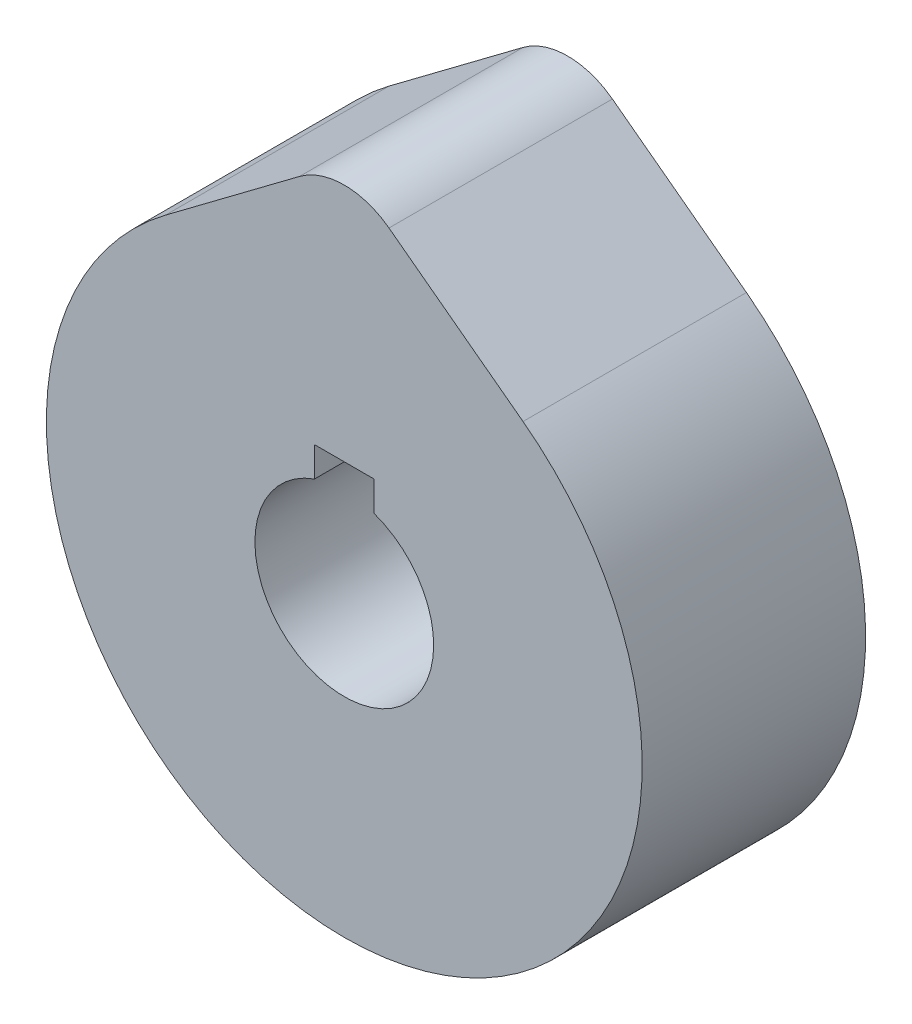
ISO-10303-21;
HEADER;
FILE_DESCRIPTION(('STEP AP214'),'2;1');
FILE_NAME('part.step','',(''),(''),'','','');
FILE_SCHEMA(('AUTOMOTIVE_DESIGN { 1 0 10303 214 1 1 1 1 }'));
ENDSEC;
DATA;
#1=APPLICATION_CONTEXT('core data for automotive mechanical design processes');
#2=APPLICATION_PROTOCOL_DEFINITION('international standard','automotive_design',2000,#1);
#3=PRODUCT_CONTEXT('',#1,'mechanical');
#4=PRODUCT('Part','Part','',(#3));
#5=PRODUCT_RELATED_PRODUCT_CATEGORY('part','',(#4));
#6=PRODUCT_DEFINITION_FORMATION('','',#4);
#7=PRODUCT_DEFINITION_CONTEXT('part definition',#1,'design');
#8=PRODUCT_DEFINITION('design','',#6,#7);
#9=PRODUCT_DEFINITION_SHAPE('','',#8);
#10=(LENGTH_UNIT() NAMED_UNIT(*) SI_UNIT(.MILLI.,.METRE.));
#11=(NAMED_UNIT(*) PLANE_ANGLE_UNIT() SI_UNIT($,.RADIAN.));
#12=(NAMED_UNIT(*) SI_UNIT($,.STERADIAN.) SOLID_ANGLE_UNIT());
#13=UNCERTAINTY_MEASURE_WITH_UNIT(LENGTH_MEASURE(1.E-05),#10,'distance_accuracy_value','');
#14=(GEOMETRIC_REPRESENTATION_CONTEXT(3) GLOBAL_UNCERTAINTY_ASSIGNED_CONTEXT((#13)) GLOBAL_UNIT_ASSIGNED_CONTEXT((#10,
#11,#12)) REPRESENTATION_CONTEXT('',''));
#15=CARTESIAN_POINT('',(0.,0.,0.));
#16=DIRECTION('',(0.,0.,1.));
#17=DIRECTION('',(1.,0.,0.));
#18=AXIS2_PLACEMENT_3D('',#15,#16,#17);
#19=CARTESIAN_POINT('',(0.,18.75,15.));
#20=DIRECTION('',(0.,0.,-1.));
#21=DIRECTION('',(-1.,0.,0.));
#22=AXIS2_PLACEMENT_3D('',#19,#20,#21);
#23=PLANE('',#22);
#24=CARTESIAN_POINT('',(0.,18.75,15.));
#25=DIRECTION('',(0.,0.,1.));
#26=DIRECTION('',(-1.,0.,0.));
#27=AXIS2_PLACEMENT_3D('',#24,#25,#26);
#28=CIRCLE('',#27,5.);
#29=CARTESIAN_POINT('',(3.00000000000002,22.75,15.));
#30=VERTEX_POINT('',#29);
#31=CARTESIAN_POINT('',(-3.00000000000002,22.75,15.));
#32=VERTEX_POINT('',#31);
#33=EDGE_CURVE('E140',#30,#32,#28,.T.);
#34=ORIENTED_EDGE('',*,*,#33,.T.);
#35=DIRECTION('',(-0.8,-0.6,0.));
#36=VECTOR('',#35,1.);
#37=CARTESIAN_POINT('',(-3.00000000000002,22.75,15.));
#38=LINE('',#37,#36);
#39=CARTESIAN_POINT('',(-12.,16.,15.));
#40=VERTEX_POINT('',#39);
#41=EDGE_CURVE('E143',#32,#40,#38,.T.);
#42=ORIENTED_EDGE('',*,*,#41,.T.);
#43=CARTESIAN_POINT('',(0.,0.,15.));
#44=DIRECTION('',(0.,0.,1.));
#45=DIRECTION('',(1.,0.,0.));
#46=AXIS2_PLACEMENT_3D('',#43,#44,#45);
#47=CIRCLE('',#46,20.);
#48=CARTESIAN_POINT('',(12.,16.,15.));
#49=VERTEX_POINT('',#48);
#50=EDGE_CURVE('E146',#40,#49,#47,.T.);
#51=ORIENTED_EDGE('',*,*,#50,.T.);
#52=DIRECTION('',(-0.8,0.6,0.));
#53=VECTOR('',#52,1.);
#54=CARTESIAN_POINT('',(3.00000000000002,22.75,15.));
#55=LINE('',#54,#53);
#56=EDGE_CURVE('E148',#49,#30,#55,.T.);
#57=ORIENTED_EDGE('',*,*,#56,.T.);
#58=EDGE_LOOP('',(#34,#42,#51,#57));
#59=FACE_BOUND('',#58,.T.);
#60=DIRECTION('',(0.,-1.,0.));
#61=VECTOR('',#60,1.);
#62=CARTESIAN_POINT('',(-2.,7.65685424949238,15.));
#63=LINE('',#62,#61);
#64=CARTESIAN_POINT('',(-2.,7.65685424949238,15.));
#65=VERTEX_POINT('',#64);
#66=CARTESIAN_POINT('',(-2.,5.65685424949238,15.));
#67=VERTEX_POINT('',#66);
#68=EDGE_CURVE('E104',#65,#67,#63,.T.);
#69=ORIENTED_EDGE('',*,*,#68,.F.);
#70=DIRECTION('',(-1.,0.,0.));
#71=VECTOR('',#70,1.);
#72=CARTESIAN_POINT('',(2.,7.65685424949238,15.));
#73=LINE('',#72,#71);
#74=CARTESIAN_POINT('',(2.,7.65685424949238,15.));
#75=VERTEX_POINT('',#74);
#76=EDGE_CURVE('E126',#75,#65,#73,.T.);
#77=ORIENTED_EDGE('',*,*,#76,.F.);
#78=DIRECTION('',(0.,1.,0.));
#79=VECTOR('',#78,1.);
#80=CARTESIAN_POINT('',(2.,7.65685424949238,15.));
#81=LINE('',#80,#79);
#82=CARTESIAN_POINT('',(2.,5.65685424949238,15.));
#83=VERTEX_POINT('',#82);
#84=EDGE_CURVE('E124',#83,#75,#81,.T.);
#85=ORIENTED_EDGE('',*,*,#84,.F.);
#86=CARTESIAN_POINT('',(0.,0.,15.));
#87=DIRECTION('',(0.,0.,1.));
#88=DIRECTION('',(1.,0.,0.));
#89=AXIS2_PLACEMENT_3D('',#86,#87,#88);
#90=CIRCLE('',#89,6.);
#91=EDGE_CURVE('E112',#67,#83,#90,.T.);
#92=ORIENTED_EDGE('',*,*,#91,.F.);
#93=EDGE_LOOP('',(#69,#77,#85,#92));
#94=FACE_BOUND('',#93,.T.);
#95=ADVANCED_FACE('F39',(#59,#94),#23,.F.);
#96=CARTESIAN_POINT('',(0.,18.75,0.));
#97=DIRECTION('',(0.,0.,-1.));
#98=DIRECTION('',(-1.,0.,0.));
#99=AXIS2_PLACEMENT_3D('',#96,#97,#98);
#100=PLANE('',#99);
#101=CARTESIAN_POINT('',(0.,18.75,0.));
#102=DIRECTION('',(0.,0.,1.));
#103=DIRECTION('',(-1.,0.,0.));
#104=AXIS2_PLACEMENT_3D('',#101,#102,#103);
#105=CIRCLE('',#104,5.);
#106=CARTESIAN_POINT('',(3.00000000000002,22.75,0.));
#107=VERTEX_POINT('',#106);
#108=CARTESIAN_POINT('',(-3.00000000000002,22.75,0.));
#109=VERTEX_POINT('',#108);
#110=EDGE_CURVE('E120',#107,#109,#105,.T.);
#111=ORIENTED_EDGE('',*,*,#110,.F.);
#112=DIRECTION('',(-0.8,0.6,0.));
#113=VECTOR('',#112,1.);
#114=CARTESIAN_POINT('',(3.00000000000002,22.75,0.));
#115=LINE('',#114,#113);
#116=CARTESIAN_POINT('',(12.,16.,0.));
#117=VERTEX_POINT('',#116);
#118=EDGE_CURVE('E144',#117,#107,#115,.T.);
#119=ORIENTED_EDGE('',*,*,#118,.F.);
#120=CARTESIAN_POINT('',(0.,0.,0.));
#121=DIRECTION('',(0.,0.,1.));
#122=DIRECTION('',(1.,0.,0.));
#123=AXIS2_PLACEMENT_3D('',#120,#121,#122);
#124=CIRCLE('',#123,20.);
#125=CARTESIAN_POINT('',(-12.,16.,0.));
#126=VERTEX_POINT('',#125);
#127=EDGE_CURVE('E155',#126,#117,#124,.T.);
#128=ORIENTED_EDGE('',*,*,#127,.F.);
#129=DIRECTION('',(-0.8,-0.6,0.));
#130=VECTOR('',#129,1.);
#131=CARTESIAN_POINT('',(-3.00000000000002,22.75,0.));
#132=LINE('',#131,#130);
#133=EDGE_CURVE('E153',#109,#126,#132,.T.);
#134=ORIENTED_EDGE('',*,*,#133,.F.);
#135=EDGE_LOOP('',(#111,#119,#128,#134));
#136=FACE_BOUND('',#135,.T.);
#137=DIRECTION('',(-1.,0.,0.));
#138=VECTOR('',#137,1.);
#139=CARTESIAN_POINT('',(2.,7.65685424949238,0.));
#140=LINE('',#139,#138);
#141=CARTESIAN_POINT('',(2.,7.65685424949238,0.));
#142=VERTEX_POINT('',#141);
#143=CARTESIAN_POINT('',(-2.,7.65685424949238,0.));
#144=VERTEX_POINT('',#143);
#145=EDGE_CURVE('E113',#142,#144,#140,.T.);
#146=ORIENTED_EDGE('',*,*,#145,.T.);
#147=DIRECTION('',(0.,-1.,0.));
#148=VECTOR('',#147,1.);
#149=CARTESIAN_POINT('',(-2.,7.65685424949238,0.));
#150=LINE('',#149,#148);
#151=CARTESIAN_POINT('',(-2.,5.65685424949238,0.));
#152=VERTEX_POINT('',#151);
#153=EDGE_CURVE('E62',#144,#152,#150,.T.);
#154=ORIENTED_EDGE('',*,*,#153,.T.);
#155=CARTESIAN_POINT('',(0.,0.,0.));
#156=DIRECTION('',(0.,0.,1.));
#157=DIRECTION('',(1.,0.,0.));
#158=AXIS2_PLACEMENT_3D('',#155,#156,#157);
#159=CIRCLE('',#158,6.);
#160=CARTESIAN_POINT('',(2.,5.65685424949238,0.));
#161=VERTEX_POINT('',#160);
#162=EDGE_CURVE('E119',#152,#161,#159,.T.);
#163=ORIENTED_EDGE('',*,*,#162,.T.);
#164=DIRECTION('',(0.,1.,0.));
#165=VECTOR('',#164,1.);
#166=CARTESIAN_POINT('',(2.,7.65685424949238,0.));
#167=LINE('',#166,#165);
#168=EDGE_CURVE('E132',#161,#142,#167,.T.);
#169=ORIENTED_EDGE('',*,*,#168,.T.);
#170=EDGE_LOOP('',(#146,#154,#163,#169));
#171=FACE_BOUND('',#170,.T.);
#172=ADVANCED_FACE('F173',(#136,#171),#100,.T.);
#173=CARTESIAN_POINT('',(0.,18.75,15.));
#174=DIRECTION('',(0.,0.,-1.));
#175=DIRECTION('',(-1.,0.,0.));
#176=AXIS2_PLACEMENT_3D('',#173,#174,#175);
#177=CYLINDRICAL_SURFACE('',#176,5.);
#178=ORIENTED_EDGE('',*,*,#110,.T.);
#179=DIRECTION('',(0.,0.,-1.));
#180=VECTOR('',#179,1.);
#181=CARTESIAN_POINT('',(-3.00000000000002,22.75,15.));
#182=LINE('',#181,#180);
#183=EDGE_CURVE('E11',#32,#109,#182,.T.);
#184=ORIENTED_EDGE('',*,*,#183,.F.);
#185=ORIENTED_EDGE('',*,*,#33,.F.);
#186=DIRECTION('',(0.,0.,-1.));
#187=VECTOR('',#186,1.);
#188=CARTESIAN_POINT('',(3.00000000000002,22.75,15.));
#189=LINE('',#188,#187);
#190=EDGE_CURVE('E150',#30,#107,#189,.T.);
#191=ORIENTED_EDGE('',*,*,#190,.T.);
#192=EDGE_LOOP('',(#178,#184,#185,#191));
#193=FACE_BOUND('',#192,.T.);
#194=ADVANCED_FACE('F41',(#193),#177,.T.);
#195=CARTESIAN_POINT('',(-3.00000000000002,22.75,15.));
#196=DIRECTION('',(0.6,-0.8,0.));
#197=DIRECTION('',(0.8,0.6,0.));
#198=AXIS2_PLACEMENT_3D('',#195,#196,#197);
#199=PLANE('',#198);
#200=ORIENTED_EDGE('',*,*,#133,.T.);
#201=DIRECTION('',(0.,0.,-1.));
#202=VECTOR('',#201,1.);
#203=CARTESIAN_POINT('',(-12.,16.,15.));
#204=LINE('',#203,#202);
#205=EDGE_CURVE('E47',#40,#126,#204,.T.);
#206=ORIENTED_EDGE('',*,*,#205,.F.);
#207=ORIENTED_EDGE('',*,*,#41,.F.);
#208=ORIENTED_EDGE('',*,*,#183,.T.);
#209=EDGE_LOOP('',(#200,#206,#207,#208));
#210=FACE_BOUND('',#209,.T.);
#211=ADVANCED_FACE('F183',(#210),#199,.F.);
#212=CARTESIAN_POINT('',(0.,0.,15.));
#213=DIRECTION('',(0.,0.,-1.));
#214=DIRECTION('',(-1.,0.,0.));
#215=AXIS2_PLACEMENT_3D('',#212,#213,#214);
#216=CYLINDRICAL_SURFACE('',#215,20.);
#217=ORIENTED_EDGE('',*,*,#127,.T.);
#218=DIRECTION('',(0.,0.,-1.));
#219=VECTOR('',#218,1.);
#220=CARTESIAN_POINT('',(12.,16.,15.));
#221=LINE('',#220,#219);
#222=EDGE_CURVE('E160',#49,#117,#221,.T.);
#223=ORIENTED_EDGE('',*,*,#222,.F.);
#224=ORIENTED_EDGE('',*,*,#50,.F.);
#225=ORIENTED_EDGE('',*,*,#205,.T.);
#226=EDGE_LOOP('',(#217,#223,#224,#225));
#227=FACE_BOUND('',#226,.T.);
#228=ADVANCED_FACE('F167',(#227),#216,.T.);
#229=CARTESIAN_POINT('',(3.00000000000002,22.75,15.));
#230=DIRECTION('',(-0.6,-0.8,0.));
#231=DIRECTION('',(0.8,-0.6,0.));
#232=AXIS2_PLACEMENT_3D('',#229,#230,#231);
#233=PLANE('',#232);
#234=ORIENTED_EDGE('',*,*,#118,.T.);
#235=ORIENTED_EDGE('',*,*,#190,.F.);
#236=ORIENTED_EDGE('',*,*,#56,.F.);
#237=ORIENTED_EDGE('',*,*,#222,.T.);
#238=EDGE_LOOP('',(#234,#235,#236,#237));
#239=FACE_BOUND('',#238,.T.);
#240=ADVANCED_FACE('F177',(#239),#233,.F.);
#241=CARTESIAN_POINT('',(-2.,7.65685424949238,15.));
#242=DIRECTION('',(1.,0.,0.));
#243=DIRECTION('',(0.,0.,-1.));
#244=AXIS2_PLACEMENT_3D('',#241,#242,#243);
#245=PLANE('',#244);
#246=ORIENTED_EDGE('',*,*,#153,.F.);
#247=DIRECTION('',(0.,0.,-1.));
#248=VECTOR('',#247,1.);
#249=CARTESIAN_POINT('',(-2.,7.65685424949238,15.));
#250=LINE('',#249,#248);
#251=EDGE_CURVE('E108',#65,#144,#250,.T.);
#252=ORIENTED_EDGE('',*,*,#251,.F.);
#253=ORIENTED_EDGE('',*,*,#68,.T.);
#254=DIRECTION('',(0.,0.,-1.));
#255=VECTOR('',#254,1.);
#256=CARTESIAN_POINT('',(-2.,5.65685424949238,15.));
#257=LINE('',#256,#255);
#258=EDGE_CURVE('E107',#67,#152,#257,.T.);
#259=ORIENTED_EDGE('',*,*,#258,.T.);
#260=EDGE_LOOP('',(#246,#252,#253,#259));
#261=FACE_BOUND('',#260,.T.);
#262=ADVANCED_FACE('F106',(#261),#245,.T.);
#263=CARTESIAN_POINT('',(0.,0.,15.));
#264=DIRECTION('',(0.,0.,-1.));
#265=DIRECTION('',(-1.,0.,0.));
#266=AXIS2_PLACEMENT_3D('',#263,#264,#265);
#267=CYLINDRICAL_SURFACE('',#266,6.);
#268=ORIENTED_EDGE('',*,*,#162,.F.);
#269=ORIENTED_EDGE('',*,*,#258,.F.);
#270=ORIENTED_EDGE('',*,*,#91,.T.);
#271=DIRECTION('',(0.,0.,-1.));
#272=VECTOR('',#271,1.);
#273=CARTESIAN_POINT('',(2.,5.65685424949238,15.));
#274=LINE('',#273,#272);
#275=EDGE_CURVE('E121',#83,#161,#274,.T.);
#276=ORIENTED_EDGE('',*,*,#275,.T.);
#277=EDGE_LOOP('',(#268,#269,#270,#276));
#278=FACE_BOUND('',#277,.T.);
#279=ADVANCED_FACE('F116',(#278),#267,.F.);
#280=CARTESIAN_POINT('',(2.,7.65685424949238,15.));
#281=DIRECTION('',(-1.,0.,0.));
#282=DIRECTION('',(0.,-1.,0.));
#283=AXIS2_PLACEMENT_3D('',#280,#281,#282);
#284=PLANE('',#283);
#285=ORIENTED_EDGE('',*,*,#168,.F.);
#286=ORIENTED_EDGE('',*,*,#275,.F.);
#287=ORIENTED_EDGE('',*,*,#84,.T.);
#288=DIRECTION('',(0.,0.,-1.));
#289=VECTOR('',#288,1.);
#290=CARTESIAN_POINT('',(2.,7.65685424949238,15.));
#291=LINE('',#290,#289);
#292=EDGE_CURVE('E54',#75,#142,#291,.T.);
#293=ORIENTED_EDGE('',*,*,#292,.T.);
#294=EDGE_LOOP('',(#285,#286,#287,#293));
#295=FACE_BOUND('',#294,.T.);
#296=ADVANCED_FACE('F206',(#295),#284,.T.);
#297=CARTESIAN_POINT('',(2.,7.65685424949238,15.));
#298=DIRECTION('',(0.,-1.,0.));
#299=DIRECTION('',(1.,0.,0.));
#300=AXIS2_PLACEMENT_3D('',#297,#298,#299);
#301=PLANE('',#300);
#302=ORIENTED_EDGE('',*,*,#145,.F.);
#303=ORIENTED_EDGE('',*,*,#292,.F.);
#304=ORIENTED_EDGE('',*,*,#76,.T.);
#305=ORIENTED_EDGE('',*,*,#251,.T.);
#306=EDGE_LOOP('',(#302,#303,#304,#305));
#307=FACE_BOUND('',#306,.T.);
#308=ADVANCED_FACE('F210',(#307),#301,.T.);
#309=CLOSED_SHELL('',(#95,#172,#194,#211,#228,#240,#262,#279,#296,#308));
#310=MANIFOLD_SOLID_BREP('B2',#309);
#311=ADVANCED_BREP_SHAPE_REPRESENTATION('',(#18,#310),#14);
#312=SHAPE_DEFINITION_REPRESENTATION(#9,#311);
ENDSEC;
END-ISO-10303-21;
